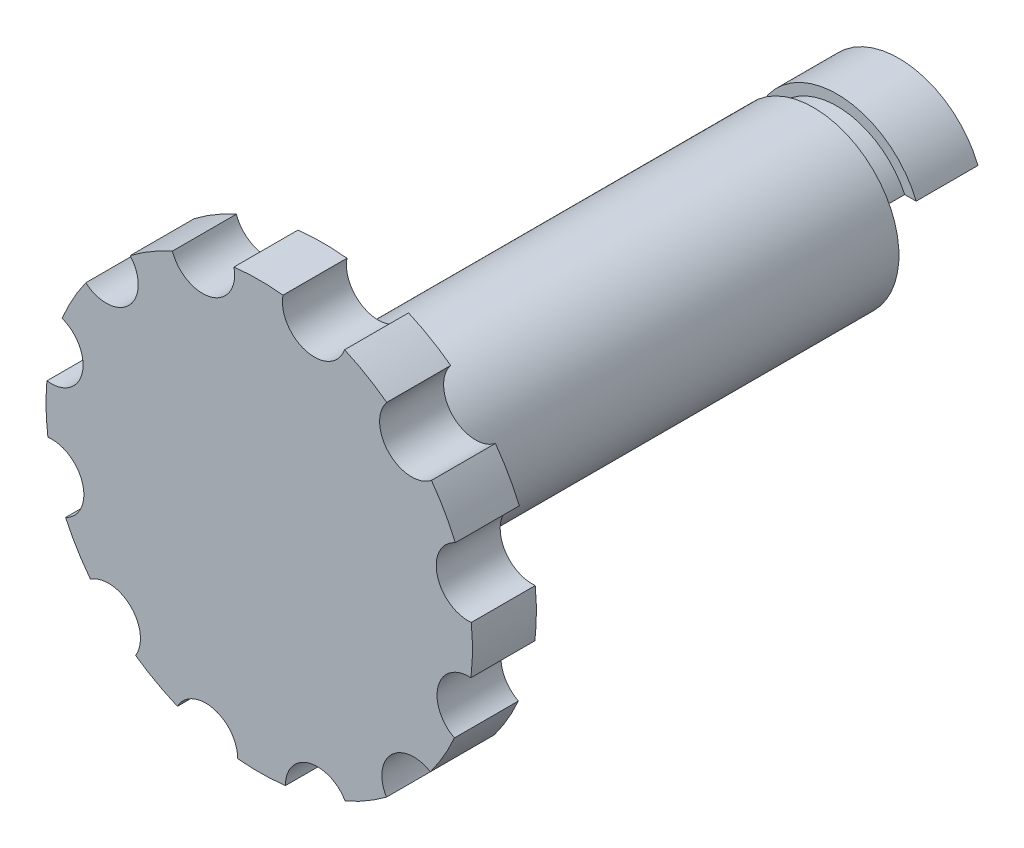
ISO-10303-21;
HEADER;
FILE_DESCRIPTION(('STEP AP214'),'2;1');
FILE_NAME('part.step','',(''),(''),'','','');
FILE_SCHEMA(('AUTOMOTIVE_DESIGN { 1 0 10303 214 1 1 1 1 }'));
ENDSEC;
DATA;
#1=APPLICATION_CONTEXT('core data for automotive mechanical design processes');
#2=APPLICATION_PROTOCOL_DEFINITION('international standard','automotive_design',2000,#1);
#3=PRODUCT_CONTEXT('',#1,'mechanical');
#4=PRODUCT('Part','Part','',(#3));
#5=PRODUCT_RELATED_PRODUCT_CATEGORY('part','',(#4));
#6=PRODUCT_DEFINITION_FORMATION('','',#4);
#7=PRODUCT_DEFINITION_CONTEXT('part definition',#1,'design');
#8=PRODUCT_DEFINITION('design','',#6,#7);
#9=PRODUCT_DEFINITION_SHAPE('','',#8);
#10=(LENGTH_UNIT() NAMED_UNIT(*) SI_UNIT(.MILLI.,.METRE.));
#11=(NAMED_UNIT(*) PLANE_ANGLE_UNIT() SI_UNIT($,.RADIAN.));
#12=(NAMED_UNIT(*) SI_UNIT($,.STERADIAN.) SOLID_ANGLE_UNIT());
#13=UNCERTAINTY_MEASURE_WITH_UNIT(LENGTH_MEASURE(1.E-05),#10,'distance_accuracy_value','');
#14=(GEOMETRIC_REPRESENTATION_CONTEXT(3) GLOBAL_UNCERTAINTY_ASSIGNED_CONTEXT((#13)) GLOBAL_UNIT_ASSIGNED_CONTEXT((#10,
#11,#12)) REPRESENTATION_CONTEXT('',''));
#15=CARTESIAN_POINT('',(0.,0.,0.));
#16=DIRECTION('',(0.,0.,1.));
#17=DIRECTION('',(1.,0.,0.));
#18=AXIS2_PLACEMENT_3D('',#15,#16,#17);
#19=CARTESIAN_POINT('',(0.,1.5,-22.));
#20=DIRECTION('',(0.,-1.,0.));
#21=DIRECTION('',(0.,0.,-1.));
#22=AXIS2_PLACEMENT_3D('',#19,#20,#21);
#23=PLANE('',#22);
#24=DIRECTION('',(-1.,0.,0.));
#25=VECTOR('',#24,1.);
#26=CARTESIAN_POINT('',(0.,1.5,-19.1));
#27=LINE('',#26,#25);
#28=CARTESIAN_POINT('',(3.70809924354783,1.5,-19.1));
#29=VERTEX_POINT('',#28);
#30=CARTESIAN_POINT('',(3.17123955301092,1.5,-19.1));
#31=VERTEX_POINT('',#30);
#32=EDGE_CURVE('E60',#29,#31,#27,.T.);
#33=ORIENTED_EDGE('',*,*,#32,.T.);
#34=DIRECTION('',(0.,0.,1.));
#35=VECTOR('',#34,1.);
#36=CARTESIAN_POINT('',(3.17123955301092,1.5,0.));
#37=LINE('',#36,#35);
#38=CARTESIAN_POINT('',(3.17123955301092,1.5,-18.));
#39=VERTEX_POINT('',#38);
#40=EDGE_CURVE('E226',#31,#39,#37,.T.);
#41=ORIENTED_EDGE('',*,*,#40,.T.);
#42=DIRECTION('',(1.,0.,0.));
#43=VECTOR('',#42,1.);
#44=CARTESIAN_POINT('',(0.,1.5,-18.));
#45=LINE('',#44,#43);
#46=CARTESIAN_POINT('',(-3.17123955301092,1.5,-18.));
#47=VERTEX_POINT('',#46);
#48=EDGE_CURVE('E399',#47,#39,#45,.T.);
#49=ORIENTED_EDGE('',*,*,#48,.F.);
#50=DIRECTION('',(0.,0.,1.));
#51=VECTOR('',#50,1.);
#52=CARTESIAN_POINT('',(-3.17123955301092,1.5,0.));
#53=LINE('',#52,#51);
#54=CARTESIAN_POINT('',(-3.17123955301092,1.5,-19.1));
#55=VERTEX_POINT('',#54);
#56=EDGE_CURVE('E240',#47,#55,#53,.F.);
#57=ORIENTED_EDGE('',*,*,#56,.T.);
#58=CARTESIAN_POINT('',(-3.70809924354783,1.5,-19.1));
#59=VERTEX_POINT('',#58);
#60=EDGE_CURVE('E245',#55,#59,#27,.T.);
#61=ORIENTED_EDGE('',*,*,#60,.T.);
#62=DIRECTION('',(0.,0.,1.));
#63=VECTOR('',#62,1.);
#64=CARTESIAN_POINT('',(-3.70809924354783,1.5,-22.));
#65=LINE('',#64,#63);
#66=CARTESIAN_POINT('',(-3.70809924354783,1.5,-22.));
#67=VERTEX_POINT('',#66);
#68=EDGE_CURVE('E402',#67,#59,#65,.T.);
#69=ORIENTED_EDGE('',*,*,#68,.F.);
#70=DIRECTION('',(1.,0.,0.));
#71=VECTOR('',#70,1.);
#72=CARTESIAN_POINT('',(0.,1.5,-22.));
#73=LINE('',#72,#71);
#74=CARTESIAN_POINT('',(3.70809924354783,1.5,-22.));
#75=VERTEX_POINT('',#74);
#76=EDGE_CURVE('E397',#67,#75,#73,.T.);
#77=ORIENTED_EDGE('',*,*,#76,.T.);
#78=DIRECTION('',(0.,0.,1.));
#79=VECTOR('',#78,1.);
#80=CARTESIAN_POINT('',(3.70809924354783,1.5,-22.));
#81=LINE('',#80,#79);
#82=EDGE_CURVE('E249',#75,#29,#81,.T.);
#83=ORIENTED_EDGE('',*,*,#82,.T.);
#84=EDGE_LOOP('',(#33,#41,#49,#57,#61,#69,#77,#83));
#85=FACE_BOUND('',#84,.T.);
#86=ADVANCED_FACE('F43',(#85),#23,.T.);
#87=CARTESIAN_POINT('',(0.,0.,-18.));
#88=DIRECTION('',(0.,0.,1.));
#89=DIRECTION('',(1.,0.,0.));
#90=AXIS2_PLACEMENT_3D('',#87,#88,#89);
#91=CYLINDRICAL_SURFACE('',#90,4.);
#92=CARTESIAN_POINT('',(0.,0.,5.));
#93=DIRECTION('',(0.,0.,-1.));
#94=DIRECTION('',(-1.,0.,0.));
#95=AXIS2_PLACEMENT_3D('',#92,#93,#94);
#96=CIRCLE('',#95,4.);
#97=CARTESIAN_POINT('',(-4.,0.,5.));
#98=VERTEX_POINT('',#97);
#99=EDGE_CURVE('E236',#98,#98,#96,.F.);
#100=ORIENTED_EDGE('',*,*,#99,.F.);
#101=EDGE_LOOP('',(#100));
#102=FACE_BOUND('',#101,.T.);
#103=CARTESIAN_POINT('',(0.,0.,-18.));
#104=DIRECTION('',(0.,0.,-1.));
#105=DIRECTION('',(-1.,0.,0.));
#106=AXIS2_PLACEMENT_3D('',#103,#104,#105);
#107=CIRCLE('',#106,4.);
#108=CARTESIAN_POINT('',(-4.,0.,-18.));
#109=VERTEX_POINT('',#108);
#110=EDGE_CURVE('E407',#109,#109,#107,.T.);
#111=ORIENTED_EDGE('',*,*,#110,.F.);
#112=EDGE_LOOP('',(#111));
#113=FACE_BOUND('',#112,.T.);
#114=ADVANCED_FACE('F550',(#102,#113),#91,.T.);
#115=CARTESIAN_POINT('',(0.,0.,-19.1));
#116=DIRECTION('',(0.,0.,1.));
#117=DIRECTION('',(1.,0.,0.));
#118=AXIS2_PLACEMENT_3D('',#115,#116,#117);
#119=CIRCLE('',#118,4.);
#120=EDGE_CURVE('E11',#29,#59,#119,.T.);
#121=ORIENTED_EDGE('',*,*,#120,.F.);
#122=ORIENTED_EDGE('',*,*,#82,.F.);
#123=CARTESIAN_POINT('',(0.,0.,-22.));
#124=DIRECTION('',(0.,0.,-1.));
#125=DIRECTION('',(-1.,0.,0.));
#126=AXIS2_PLACEMENT_3D('',#123,#124,#125);
#127=CIRCLE('',#126,4.);
#128=EDGE_CURVE('E396',#67,#75,#127,.T.);
#129=ORIENTED_EDGE('',*,*,#128,.F.);
#130=ORIENTED_EDGE('',*,*,#68,.T.);
#131=EDGE_LOOP('',(#121,#122,#129,#130));
#132=FACE_BOUND('',#131,.T.);
#133=ADVANCED_FACE('F554',(#132),#91,.T.);
#134=CARTESIAN_POINT('',(0.,0.,8.));
#135=DIRECTION('',(0.,0.,-1.));
#136=DIRECTION('',(-1.,0.,0.));
#137=AXIS2_PLACEMENT_3D('',#134,#135,#136);
#138=CYLINDRICAL_SURFACE('',#137,10.);
#139=CARTESIAN_POINT('',(0.,0.,5.));
#140=DIRECTION('',(0.,0.,-1.));
#141=DIRECTION('',(-1.,0.,0.));
#142=AXIS2_PLACEMENT_3D('',#139,#140,#141);
#143=CIRCLE('',#142,10.);
#144=CARTESIAN_POINT('',(-9.90917159457001,-1.34473726406572,5.));
#145=VERTEX_POINT('',#144);
#146=CARTESIAN_POINT('',(-9.95746445214562,0.92135860784842,5.));
#147=VERTEX_POINT('',#146);
#148=EDGE_CURVE('E260',#145,#147,#143,.T.);
#149=ORIENTED_EDGE('',*,*,#148,.F.);
#150=DIRECTION('',(0.,0.,1.));
#151=VECTOR('',#150,1.);
#152=CARTESIAN_POINT('',(-9.90917159457001,-1.34473726406572,-7.));
#153=LINE('',#152,#151);
#154=CARTESIAN_POINT('',(-9.90917159457001,-1.34473726406572,8.));
#155=VERTEX_POINT('',#154);
#156=EDGE_CURVE('E393',#145,#155,#153,.T.);
#157=ORIENTED_EDGE('',*,*,#156,.T.);
#158=CARTESIAN_POINT('',(0.,0.,8.));
#159=DIRECTION('',(0.,0.,1.));
#160=DIRECTION('',(1.,0.,0.));
#161=AXIS2_PLACEMENT_3D('',#158,#159,#160);
#162=CIRCLE('',#161,10.);
#163=CARTESIAN_POINT('',(-9.95746445214562,0.92135860784842,8.));
#164=VERTEX_POINT('',#163);
#165=EDGE_CURVE('E433',#164,#155,#162,.T.);
#166=ORIENTED_EDGE('',*,*,#165,.F.);
#167=DIRECTION('',(0.,0.,1.));
#168=VECTOR('',#167,1.);
#169=CARTESIAN_POINT('',(-9.95746445214562,0.92135860784842,-7.));
#170=LINE('',#169,#168);
#171=EDGE_CURVE('E355',#164,#147,#170,.F.);
#172=ORIENTED_EDGE('',*,*,#171,.T.);
#173=EDGE_LOOP('',(#149,#157,#166,#172));
#174=FACE_BOUND('',#173,.T.);
#175=ADVANCED_FACE('F44',(#174),#138,.T.);
#176=CARTESIAN_POINT('',(0.,0.,5.));
#177=DIRECTION('',(0.,0.,-1.));
#178=DIRECTION('',(-1.,0.,0.));
#179=AXIS2_PLACEMENT_3D('',#176,#177,#178);
#180=CIRCLE('',#179,10.);
#181=CARTESIAN_POINT('',(-7.91348405973703,-6.11365439293782,5.));
#182=VERTEX_POINT('',#181);
#183=CARTESIAN_POINT('',(-9.08051493621667,-4.18858550027883,5.));
#184=VERTEX_POINT('',#183);
#185=EDGE_CURVE('E62',#182,#184,#180,.T.);
#186=ORIENTED_EDGE('',*,*,#185,.F.);
#187=DIRECTION('',(0.,0.,1.));
#188=VECTOR('',#187,1.);
#189=CARTESIAN_POINT('',(-7.91348405973703,-6.11365439293782,-7.));
#190=LINE('',#189,#188);
#191=CARTESIAN_POINT('',(-7.91348405973703,-6.11365439293782,8.));
#192=VERTEX_POINT('',#191);
#193=EDGE_CURVE('E387',#182,#192,#190,.T.);
#194=ORIENTED_EDGE('',*,*,#193,.T.);
#195=CARTESIAN_POINT('',(-9.08051493621667,-4.18858550027883,8.));
#196=VERTEX_POINT('',#195);
#197=EDGE_CURVE('E438',#196,#192,#162,.T.);
#198=ORIENTED_EDGE('',*,*,#197,.F.);
#199=DIRECTION('',(0.,0.,1.));
#200=VECTOR('',#199,1.);
#201=CARTESIAN_POINT('',(-9.08051493621667,-4.18858550027883,-7.));
#202=LINE('',#201,#200);
#203=EDGE_CURVE('E395',#196,#184,#202,.F.);
#204=ORIENTED_EDGE('',*,*,#203,.T.);
#205=EDGE_LOOP('',(#186,#194,#198,#204));
#206=FACE_BOUND('',#205,.T.);
#207=ADVANCED_FACE('F519',(#206),#138,.T.);
#208=CARTESIAN_POINT('',(0.,0.,5.));
#209=DIRECTION('',(0.,0.,-1.));
#210=DIRECTION('',(-1.,0.,0.));
#211=AXIS2_PLACEMENT_3D('',#208,#209,#210);
#212=CIRCLE('',#211,10.);
#213=CARTESIAN_POINT('',(-3.83432726912444,-9.23568808444984,5.));
#214=VERTEX_POINT('',#213);
#215=CARTESIAN_POINT('',(-5.79698261183855,-8.14831225457404,5.));
#216=VERTEX_POINT('',#215);
#217=EDGE_CURVE('E300',#214,#216,#212,.T.);
#218=ORIENTED_EDGE('',*,*,#217,.F.);
#219=DIRECTION('',(0.,0.,1.));
#220=VECTOR('',#219,1.);
#221=CARTESIAN_POINT('',(-3.83432726912443,-9.23568808444984,-7.));
#222=LINE('',#221,#220);
#223=CARTESIAN_POINT('',(-3.83432726912443,-9.23568808444984,8.));
#224=VERTEX_POINT('',#223);
#225=EDGE_CURVE('E383',#214,#224,#222,.T.);
#226=ORIENTED_EDGE('',*,*,#225,.T.);
#227=CARTESIAN_POINT('',(-5.79698261183855,-8.14831225457404,8.));
#228=VERTEX_POINT('',#227);
#229=EDGE_CURVE('E444',#228,#224,#162,.T.);
#230=ORIENTED_EDGE('',*,*,#229,.F.);
#231=DIRECTION('',(0.,0.,1.));
#232=VECTOR('',#231,1.);
#233=CARTESIAN_POINT('',(-5.79698261183855,-8.14831225457404,-7.));
#234=LINE('',#233,#232);
#235=EDGE_CURVE('E386',#228,#216,#234,.F.);
#236=ORIENTED_EDGE('',*,*,#235,.T.);
#237=EDGE_LOOP('',(#218,#226,#230,#236));
#238=FACE_BOUND('',#237,.T.);
#239=ADVANCED_FACE('F521',(#238),#138,.T.);
#240=CARTESIAN_POINT('',(0.,0.,5.));
#241=DIRECTION('',(0.,0.,-1.));
#242=DIRECTION('',(-1.,0.,0.));
#243=AXIS2_PLACEMENT_3D('',#240,#241,#242);
#244=CIRCLE('',#243,10.);
#245=CARTESIAN_POINT('',(1.23126987604767,-9.92390923438629,5.));
#246=VERTEX_POINT('',#245);
#247=CARTESIAN_POINT('',(-1.01050990389204,-9.9488124785894,5.));
#248=VERTEX_POINT('',#247);
#249=EDGE_CURVE('E293',#246,#248,#244,.T.);
#250=ORIENTED_EDGE('',*,*,#249,.F.);
#251=DIRECTION('',(0.,0.,1.));
#252=VECTOR('',#251,1.);
#253=CARTESIAN_POINT('',(1.23126987604767,-9.92390923438629,-7.));
#254=LINE('',#253,#252);
#255=CARTESIAN_POINT('',(1.23126987604767,-9.92390923438629,8.));
#256=VERTEX_POINT('',#255);
#257=EDGE_CURVE('E379',#246,#256,#254,.T.);
#258=ORIENTED_EDGE('',*,*,#257,.T.);
#259=CARTESIAN_POINT('',(-1.01050990389204,-9.9488124785894,8.));
#260=VERTEX_POINT('',#259);
#261=EDGE_CURVE('E449',#260,#256,#162,.T.);
#262=ORIENTED_EDGE('',*,*,#261,.F.);
#263=DIRECTION('',(0.,0.,1.));
#264=VECTOR('',#263,1.);
#265=CARTESIAN_POINT('',(-1.01050990389204,-9.9488124785894,-7.));
#266=LINE('',#265,#264);
#267=EDGE_CURVE('E385',#260,#248,#266,.F.);
#268=ORIENTED_EDGE('',*,*,#267,.T.);
#269=EDGE_LOOP('',(#250,#258,#262,#268));
#270=FACE_BOUND('',#269,.T.);
#271=ADVANCED_FACE('F535',(#270),#138,.T.);
#272=CARTESIAN_POINT('',(0.,0.,5.));
#273=DIRECTION('',(0.,0.,-1.));
#274=DIRECTION('',(-1.,0.,0.));
#275=AXIS2_PLACEMENT_3D('',#272,#273,#274);
#276=CIRCLE('',#275,10.);
#277=CARTESIAN_POINT('',(5.96742383944693,-8.02432880186252,5.));
#278=VERTEX_POINT('',#277);
#279=CARTESIAN_POINT('',(4.02980613219721,-9.15208514694361,5.));
#280=VERTEX_POINT('',#279);
#281=EDGE_CURVE('E292',#278,#280,#276,.T.);
#282=ORIENTED_EDGE('',*,*,#281,.F.);
#283=DIRECTION('',(0.,0.,1.));
#284=VECTOR('',#283,1.);
#285=CARTESIAN_POINT('',(5.96742383944694,-8.02432880186252,-7.));
#286=LINE('',#285,#284);
#287=CARTESIAN_POINT('',(5.96742383944694,-8.02432880186252,8.));
#288=VERTEX_POINT('',#287);
#289=EDGE_CURVE('E371',#278,#288,#286,.T.);
#290=ORIENTED_EDGE('',*,*,#289,.T.);
#291=CARTESIAN_POINT('',(4.02980613219721,-9.15208514694361,8.));
#292=VERTEX_POINT('',#291);
#293=EDGE_CURVE('E420',#292,#288,#162,.T.);
#294=ORIENTED_EDGE('',*,*,#293,.F.);
#295=DIRECTION('',(0.,0.,1.));
#296=VECTOR('',#295,1.);
#297=CARTESIAN_POINT('',(4.02980613219721,-9.15208514694361,-7.));
#298=LINE('',#297,#296);
#299=EDGE_CURVE('E380',#292,#280,#298,.F.);
#300=ORIENTED_EDGE('',*,*,#299,.T.);
#301=EDGE_LOOP('',(#282,#290,#294,#300));
#302=FACE_BOUND('',#301,.T.);
#303=ADVANCED_FACE('F458',(#302),#138,.T.);
#304=CARTESIAN_POINT('',(0.,0.,5.));
#305=DIRECTION('',(0.,0.,-1.));
#306=DIRECTION('',(-1.,0.,0.));
#307=AXIS2_PLACEMENT_3D('',#304,#305,#306);
#308=CIRCLE('',#307,10.);
#309=CARTESIAN_POINT('',(9.15427922502021,-4.02481948295367,5.));
#310=VERTEX_POINT('',#309);
#311=CARTESIAN_POINT('',(8.02648080471782,-5.96452897482243,5.));
#312=VERTEX_POINT('',#311);
#313=EDGE_CURVE('E286',#310,#312,#308,.T.);
#314=ORIENTED_EDGE('',*,*,#313,.F.);
#315=DIRECTION('',(0.,0.,1.));
#316=VECTOR('',#315,1.);
#317=CARTESIAN_POINT('',(9.15427922502021,-4.02481948295366,-7.));
#318=LINE('',#317,#316);
#319=CARTESIAN_POINT('',(9.15427922502021,-4.02481948295366,8.));
#320=VERTEX_POINT('',#319);
#321=EDGE_CURVE('E368',#310,#320,#318,.T.);
#322=ORIENTED_EDGE('',*,*,#321,.T.);
#323=CARTESIAN_POINT('',(8.02648080471782,-5.96452897482243,8.));
#324=VERTEX_POINT('',#323);
#325=EDGE_CURVE('E413',#324,#320,#162,.T.);
#326=ORIENTED_EDGE('',*,*,#325,.F.);
#327=DIRECTION('',(0.,0.,1.));
#328=VECTOR('',#327,1.);
#329=CARTESIAN_POINT('',(8.02648080471782,-5.96452897482243,-7.));
#330=LINE('',#329,#328);
#331=EDGE_CURVE('E374',#324,#312,#330,.F.);
#332=ORIENTED_EDGE('',*,*,#331,.T.);
#333=EDGE_LOOP('',(#314,#322,#326,#332));
#334=FACE_BOUND('',#333,.T.);
#335=ADVANCED_FACE('F470',(#334),#138,.T.);
#336=CARTESIAN_POINT('',(0.,0.,5.));
#337=DIRECTION('',(0.,0.,-1.));
#338=DIRECTION('',(-1.,0.,0.));
#339=AXIS2_PLACEMENT_3D('',#336,#337,#338);
#340=CIRCLE('',#339,10.);
#341=CARTESIAN_POINT('',(4.00388130166313,9.16345647243399,5.));
#342=VERTEX_POINT('',#341);
#343=CARTESIAN_POINT('',(5.98029267254369,8.01474263783437,5.));
#344=VERTEX_POINT('',#343);
#345=EDGE_CURVE('E274',#342,#344,#340,.T.);
#346=ORIENTED_EDGE('',*,*,#345,.F.);
#347=DIRECTION('',(0.,0.,1.));
#348=VECTOR('',#347,1.);
#349=CARTESIAN_POINT('',(4.00388130166314,9.16345647243399,-7.));
#350=LINE('',#349,#348);
#351=CARTESIAN_POINT('',(4.00388130166314,9.16345647243399,8.));
#352=VERTEX_POINT('',#351);
#353=EDGE_CURVE('E362',#342,#352,#350,.T.);
#354=ORIENTED_EDGE('',*,*,#353,.T.);
#355=CARTESIAN_POINT('',(5.98029267254369,8.01474263783437,8.));
#356=VERTEX_POINT('',#355);
#357=EDGE_CURVE('E417',#356,#352,#162,.T.);
#358=ORIENTED_EDGE('',*,*,#357,.F.);
#359=DIRECTION('',(0.,0.,1.));
#360=VECTOR('',#359,1.);
#361=CARTESIAN_POINT('',(5.98029267254369,8.01474263783437,-7.));
#362=LINE('',#361,#360);
#363=EDGE_CURVE('E340',#356,#344,#362,.F.);
#364=ORIENTED_EDGE('',*,*,#363,.T.);
#365=EDGE_LOOP('',(#346,#354,#358,#364));
#366=FACE_BOUND('',#365,.T.);
#367=ADVANCED_FACE('F488',(#366),#138,.T.);
#368=CARTESIAN_POINT('',(0.,0.,5.));
#369=DIRECTION('',(0.,0.,-1.));
#370=DIRECTION('',(-1.,0.,0.));
#371=AXIS2_PLACEMENT_3D('',#368,#369,#370);
#372=CIRCLE('',#371,10.);
#373=CARTESIAN_POINT('',(9.94384762083846,1.05825067613741,5.));
#374=VERTEX_POINT('',#373);
#375=CARTESIAN_POINT('',(9.92859616144193,-1.19288652561782,5.));
#376=VERTEX_POINT('',#375);
#377=EDGE_CURVE('E284',#374,#376,#372,.T.);
#378=ORIENTED_EDGE('',*,*,#377,.F.);
#379=DIRECTION('',(0.,0.,1.));
#380=VECTOR('',#379,1.);
#381=CARTESIAN_POINT('',(9.94384762083846,1.05825067613742,-7.));
#382=LINE('',#381,#380);
#383=CARTESIAN_POINT('',(9.94384762083846,1.05825067613742,8.));
#384=VERTEX_POINT('',#383);
#385=EDGE_CURVE('E358',#374,#384,#382,.T.);
#386=ORIENTED_EDGE('',*,*,#385,.T.);
#387=CARTESIAN_POINT('',(9.92859616144193,-1.19288652561782,8.));
#388=VERTEX_POINT('',#387);
#389=EDGE_CURVE('E410',#388,#384,#162,.T.);
#390=ORIENTED_EDGE('',*,*,#389,.F.);
#391=DIRECTION('',(0.,0.,1.));
#392=VECTOR('',#391,1.);
#393=CARTESIAN_POINT('',(9.92859616144193,-1.19288652561782,-7.));
#394=LINE('',#393,#392);
#395=EDGE_CURVE('E370',#388,#376,#394,.F.);
#396=ORIENTED_EDGE('',*,*,#395,.T.);
#397=EDGE_LOOP('',(#378,#386,#390,#396));
#398=FACE_BOUND('',#397,.T.);
#399=ADVANCED_FACE('F474',(#398),#138,.T.);
#400=CARTESIAN_POINT('',(0.,0.,5.));
#401=DIRECTION('',(0.,0.,-1.));
#402=DIRECTION('',(-1.,0.,0.));
#403=AXIS2_PLACEMENT_3D('',#400,#401,#402);
#404=CIRCLE('',#403,10.);
#405=CARTESIAN_POINT('',(-9.24320622023551,3.81616807415496,5.));
#406=VERTEX_POINT('',#405);
#407=CARTESIAN_POINT('',(-8.13503843802609,5.81559537896491,5.));
#408=VERTEX_POINT('',#407);
#409=EDGE_CURVE('E261',#406,#408,#404,.T.);
#410=ORIENTED_EDGE('',*,*,#409,.F.);
#411=DIRECTION('',(0.,0.,1.));
#412=VECTOR('',#411,1.);
#413=CARTESIAN_POINT('',(-9.24320622023551,3.81616807415496,-7.));
#414=LINE('',#413,#412);
#415=CARTESIAN_POINT('',(-9.24320622023551,3.81616807415496,8.));
#416=VERTEX_POINT('',#415);
#417=EDGE_CURVE('E354',#406,#416,#414,.T.);
#418=ORIENTED_EDGE('',*,*,#417,.T.);
#419=CARTESIAN_POINT('',(-8.13503843802609,5.81559537896491,8.));
#420=VERTEX_POINT('',#419);
#421=EDGE_CURVE('E432',#420,#416,#162,.T.);
#422=ORIENTED_EDGE('',*,*,#421,.F.);
#423=DIRECTION('',(0.,0.,1.));
#424=VECTOR('',#423,1.);
#425=CARTESIAN_POINT('',(-8.13503843802609,5.81559537896491,-7.));
#426=LINE('',#425,#424);
#427=EDGE_CURVE('E350',#420,#408,#426,.F.);
#428=ORIENTED_EDGE('',*,*,#427,.T.);
#429=EDGE_LOOP('',(#410,#418,#422,#428));
#430=FACE_BOUND('',#429,.T.);
#431=ADVANCED_FACE('F510',(#430),#138,.T.);
#432=CARTESIAN_POINT('',(0.,0.,5.));
#433=DIRECTION('',(0.,0.,-1.));
#434=DIRECTION('',(-1.,0.,0.));
#435=AXIS2_PLACEMENT_3D('',#432,#433,#434);
#436=CIRCLE('',#435,10.);
#437=CARTESIAN_POINT('',(-6.05082845848132,7.9616251460385,5.));
#438=VERTEX_POINT('',#437);
#439=CARTESIAN_POINT('',(-4.07197032619047,9.13340339975325,5.));
#440=VERTEX_POINT('',#439);
#441=EDGE_CURVE('E270',#438,#440,#436,.T.);
#442=ORIENTED_EDGE('',*,*,#441,.F.);
#443=DIRECTION('',(0.,0.,1.));
#444=VECTOR('',#443,1.);
#445=CARTESIAN_POINT('',(-6.05082845848132,7.9616251460385,-7.));
#446=LINE('',#445,#444);
#447=CARTESIAN_POINT('',(-6.05082845848132,7.9616251460385,8.));
#448=VERTEX_POINT('',#447);
#449=EDGE_CURVE('E349',#438,#448,#446,.T.);
#450=ORIENTED_EDGE('',*,*,#449,.T.);
#451=CARTESIAN_POINT('',(-4.07197032619047,9.13340339975325,8.));
#452=VERTEX_POINT('',#451);
#453=EDGE_CURVE('E430',#452,#448,#162,.T.);
#454=ORIENTED_EDGE('',*,*,#453,.F.);
#455=DIRECTION('',(0.,0.,1.));
#456=VECTOR('',#455,1.);
#457=CARTESIAN_POINT('',(-4.07197032619047,9.13340339975325,-7.));
#458=LINE('',#457,#456);
#459=EDGE_CURVE('E345',#452,#440,#458,.F.);
#460=ORIENTED_EDGE('',*,*,#459,.T.);
#461=EDGE_LOOP('',(#442,#450,#454,#460));
#462=FACE_BOUND('',#461,.T.);
#463=ADVANCED_FACE('F499',(#462),#138,.T.);
#464=CARTESIAN_POINT('',(0.,0.,5.));
#465=DIRECTION('',(0.,0.,-1.));
#466=DIRECTION('',(-1.,0.,0.));
#467=AXIS2_PLACEMENT_3D('',#464,#465,#466);
#468=CIRCLE('',#467,10.);
#469=CARTESIAN_POINT('',(-1.18549028217473,9.92948200012817,5.));
#470=VERTEX_POINT('',#469);
#471=CARTESIAN_POINT('',(1.11426531523922,9.93772674243234,5.));
#472=VERTEX_POINT('',#471);
#473=EDGE_CURVE('E271',#470,#472,#468,.T.);
#474=ORIENTED_EDGE('',*,*,#473,.F.);
#475=DIRECTION('',(0.,0.,1.));
#476=VECTOR('',#475,1.);
#477=CARTESIAN_POINT('',(-1.18549028217473,9.92948200012817,-7.));
#478=LINE('',#477,#476);
#479=CARTESIAN_POINT('',(-1.18549028217473,9.92948200012817,8.));
#480=VERTEX_POINT('',#479);
#481=EDGE_CURVE('E344',#470,#480,#478,.T.);
#482=ORIENTED_EDGE('',*,*,#481,.T.);
#483=CARTESIAN_POINT('',(1.11426531523922,9.93772674243234,8.));
#484=VERTEX_POINT('',#483);
#485=EDGE_CURVE('E423',#484,#480,#162,.T.);
#486=ORIENTED_EDGE('',*,*,#485,.F.);
#487=DIRECTION('',(0.,0.,1.));
#488=VECTOR('',#487,1.);
#489=CARTESIAN_POINT('',(1.11426531523922,9.93772674243234,-7.));
#490=LINE('',#489,#488);
#491=EDGE_CURVE('E361',#484,#472,#490,.F.);
#492=ORIENTED_EDGE('',*,*,#491,.T.);
#493=EDGE_LOOP('',(#474,#482,#486,#492));
#494=FACE_BOUND('',#493,.T.);
#495=ADVANCED_FACE('F493',(#494),#138,.T.);
#496=CARTESIAN_POINT('',(0.,0.,5.));
#497=DIRECTION('',(0.,0.,-1.));
#498=DIRECTION('',(-1.,0.,0.));
#499=AXIS2_PLACEMENT_3D('',#496,#497,#498);
#500=CIRCLE('',#499,10.);
#501=CARTESIAN_POINT('',(8.07745667721353,5.89531115614252,5.));
#502=VERTEX_POINT('',#501);
#503=CARTESIAN_POINT('',(9.19759452981835,3.92482545663569,5.));
#504=VERTEX_POINT('',#503);
#505=EDGE_CURVE('E278',#502,#504,#500,.T.);
#506=ORIENTED_EDGE('',*,*,#505,.F.);
#507=DIRECTION('',(0.,0.,1.));
#508=VECTOR('',#507,1.);
#509=CARTESIAN_POINT('',(8.07745667721353,5.89531115614252,-7.));
#510=LINE('',#509,#508);
#511=CARTESIAN_POINT('',(8.07745667721353,5.89531115614252,8.));
#512=VERTEX_POINT('',#511);
#513=EDGE_CURVE('E337',#502,#512,#510,.T.);
#514=ORIENTED_EDGE('',*,*,#513,.T.);
#515=CARTESIAN_POINT('',(9.19759452981835,3.92482545663569,8.));
#516=VERTEX_POINT('',#515);
#517=EDGE_CURVE('E51',#516,#512,#162,.T.);
#518=ORIENTED_EDGE('',*,*,#517,.F.);
#519=DIRECTION('',(0.,0.,1.));
#520=VECTOR('',#519,1.);
#521=CARTESIAN_POINT('',(9.19759452981835,3.92482545663569,-7.));
#522=LINE('',#521,#520);
#523=EDGE_CURVE('E360',#516,#504,#522,.F.);
#524=ORIENTED_EDGE('',*,*,#523,.T.);
#525=EDGE_LOOP('',(#506,#514,#518,#524));
#526=FACE_BOUND('',#525,.T.);
#527=ADVANCED_FACE('F477',(#526),#138,.T.);
#528=CARTESIAN_POINT('',(7.14670622053036,7.07162046384355,-22.));
#529=DIRECTION('',(0.,0.,1.));
#530=DIRECTION('',(1.,0.,0.));
#531=AXIS2_PLACEMENT_3D('',#528,#529,#530);
#532=CYLINDRICAL_SURFACE('',#531,1.5);
#533=CARTESIAN_POINT('',(7.14670622053036,7.07162046384355,5.));
#534=DIRECTION('',(0.,0.,-1.));
#535=DIRECTION('',(-1.,0.,0.));
#536=AXIS2_PLACEMENT_3D('',#533,#534,#535);
#537=CIRCLE('',#536,1.5);
#538=EDGE_CURVE('E280',#344,#502,#537,.F.);
#539=ORIENTED_EDGE('',*,*,#538,.F.);
#540=ORIENTED_EDGE('',*,*,#363,.F.);
#541=CARTESIAN_POINT('',(7.14670622053036,7.07162046384355,8.));
#542=DIRECTION('',(0.,0.,1.));
#543=DIRECTION('',(1.,0.,0.));
#544=AXIS2_PLACEMENT_3D('',#541,#542,#543);
#545=CIRCLE('',#544,1.5);
#546=EDGE_CURVE('E328',#356,#512,#545,.T.);
#547=ORIENTED_EDGE('',*,*,#546,.T.);
#548=ORIENTED_EDGE('',*,*,#513,.F.);
#549=EDGE_LOOP('',(#539,#540,#547,#548));
#550=FACE_BOUND('',#549,.T.);
#551=ADVANCED_FACE('F481',(#550),#532,.F.);
#552=CARTESIAN_POINT('',(-2.65341890844178,9.62096044790578,-22.));
#553=DIRECTION('',(0.,0.,1.));
#554=DIRECTION('',(1.,0.,0.));
#555=AXIS2_PLACEMENT_3D('',#552,#553,#554);
#556=CYLINDRICAL_SURFACE('',#555,1.5);
#557=CARTESIAN_POINT('',(-2.65341890844178,9.62096044790578,5.));
#558=DIRECTION('',(0.,0.,-1.));
#559=DIRECTION('',(-1.,0.,0.));
#560=AXIS2_PLACEMENT_3D('',#557,#558,#559);
#561=CIRCLE('',#560,1.5);
#562=EDGE_CURVE('E267',#440,#470,#561,.F.);
#563=ORIENTED_EDGE('',*,*,#562,.F.);
#564=ORIENTED_EDGE('',*,*,#459,.F.);
#565=CARTESIAN_POINT('',(-2.65341890844178,9.62096044790578,8.));
#566=DIRECTION('',(0.,0.,1.));
#567=DIRECTION('',(1.,0.,0.));
#568=AXIS2_PLACEMENT_3D('',#565,#566,#567);
#569=CIRCLE('',#568,1.5);
#570=EDGE_CURVE('E303',#452,#480,#569,.T.);
#571=ORIENTED_EDGE('',*,*,#570,.T.);
#572=ORIENTED_EDGE('',*,*,#481,.F.);
#573=EDGE_LOOP('',(#563,#564,#571,#572));
#574=FACE_BOUND('',#573,.T.);
#575=ADVANCED_FACE('F500',(#574),#556,.F.);
#576=CARTESIAN_POINT('',(-7.17363686296203,6.96698888748592,-22.));
#577=DIRECTION('',(0.,0.,1.));
#578=DIRECTION('',(1.,0.,0.));
#579=AXIS2_PLACEMENT_3D('',#576,#577,#578);
#580=CYLINDRICAL_SURFACE('',#579,1.5);
#581=CARTESIAN_POINT('',(-7.17363686296203,6.96698888748592,5.));
#582=DIRECTION('',(0.,0.,-1.));
#583=DIRECTION('',(-1.,0.,0.));
#584=AXIS2_PLACEMENT_3D('',#581,#582,#583);
#585=CIRCLE('',#584,1.5);
#586=EDGE_CURVE('E262',#408,#438,#585,.F.);
#587=ORIENTED_EDGE('',*,*,#586,.F.);
#588=ORIENTED_EDGE('',*,*,#427,.F.);
#589=CARTESIAN_POINT('',(-7.17363686296203,6.96698888748592,8.));
#590=DIRECTION('',(0.,0.,1.));
#591=DIRECTION('',(1.,0.,0.));
#592=AXIS2_PLACEMENT_3D('',#589,#590,#591);
#593=CIRCLE('',#592,1.5);
#594=EDGE_CURVE('E307',#420,#448,#593,.T.);
#595=ORIENTED_EDGE('',*,*,#594,.T.);
#596=ORIENTED_EDGE('',*,*,#449,.F.);
#597=EDGE_LOOP('',(#587,#588,#595,#596));
#598=FACE_BOUND('',#597,.T.);
#599=ADVANCED_FACE('F503',(#598),#580,.F.);
#600=CARTESIAN_POINT('',(-9.76127466200916,2.40847311798078,-22.));
#601=DIRECTION('',(0.,0.,1.));
#602=DIRECTION('',(1.,0.,0.));
#603=AXIS2_PLACEMENT_3D('',#600,#601,#602);
#604=CYLINDRICAL_SURFACE('',#603,1.5);
#605=CARTESIAN_POINT('',(-9.76127466200916,2.40847311798078,5.));
#606=DIRECTION('',(0.,0.,-1.));
#607=DIRECTION('',(-1.,0.,0.));
#608=AXIS2_PLACEMENT_3D('',#605,#606,#607);
#609=CIRCLE('',#608,1.5);
#610=EDGE_CURVE('E263',#147,#406,#609,.F.);
#611=ORIENTED_EDGE('',*,*,#610,.F.);
#612=ORIENTED_EDGE('',*,*,#171,.F.);
#613=CARTESIAN_POINT('',(-9.76127466200916,2.40847311798078,8.));
#614=DIRECTION('',(0.,0.,1.));
#615=DIRECTION('',(1.,0.,0.));
#616=AXIS2_PLACEMENT_3D('',#613,#614,#615);
#617=CIRCLE('',#616,1.5);
#618=EDGE_CURVE('E305',#164,#416,#617,.T.);
#619=ORIENTED_EDGE('',*,*,#618,.T.);
#620=ORIENTED_EDGE('',*,*,#417,.F.);
#621=EDGE_LOOP('',(#611,#612,#619,#620));
#622=FACE_BOUND('',#621,.T.);
#623=ADVANCED_FACE('F514',(#622),#604,.F.);
#624=CARTESIAN_POINT('',(9.80067778095021,2.55140250932331,-22.));
#625=DIRECTION('',(0.,0.,1.));
#626=DIRECTION('',(1.,0.,0.));
#627=AXIS2_PLACEMENT_3D('',#624,#625,#626);
#628=CYLINDRICAL_SURFACE('',#627,1.5);
#629=CARTESIAN_POINT('',(9.80067778095021,2.55140250932331,5.));
#630=DIRECTION('',(0.,0.,-1.));
#631=DIRECTION('',(-1.,0.,0.));
#632=AXIS2_PLACEMENT_3D('',#629,#630,#631);
#633=CIRCLE('',#632,1.5);
#634=EDGE_CURVE('E282',#504,#374,#633,.F.);
#635=ORIENTED_EDGE('',*,*,#634,.F.);
#636=ORIENTED_EDGE('',*,*,#523,.F.);
#637=CARTESIAN_POINT('',(9.80067778095021,2.55140250932331,8.));
#638=DIRECTION('',(0.,0.,1.));
#639=DIRECTION('',(1.,0.,0.));
#640=AXIS2_PLACEMENT_3D('',#637,#638,#639);
#641=CIRCLE('',#640,1.5);
#642=EDGE_CURVE('E322',#516,#384,#641,.T.);
#643=ORIENTED_EDGE('',*,*,#642,.T.);
#644=ORIENTED_EDGE('',*,*,#385,.F.);
#645=EDGE_LOOP('',(#635,#636,#643,#644));
#646=FACE_BOUND('',#645,.T.);
#647=ADVANCED_FACE('F478',(#646),#628,.F.);
#648=CARTESIAN_POINT('',(2.58819045102521,9.65925826289068,-22.));
#649=DIRECTION('',(0.,0.,1.));
#650=DIRECTION('',(1.,0.,0.));
#651=AXIS2_PLACEMENT_3D('',#648,#649,#650);
#652=CYLINDRICAL_SURFACE('',#651,1.5);
#653=CARTESIAN_POINT('',(2.58819045102521,9.65925826289068,5.));
#654=DIRECTION('',(0.,0.,-1.));
#655=DIRECTION('',(-1.,0.,0.));
#656=AXIS2_PLACEMENT_3D('',#653,#654,#655);
#657=CIRCLE('',#656,1.5);
#658=EDGE_CURVE('E273',#472,#342,#657,.F.);
#659=ORIENTED_EDGE('',*,*,#658,.F.);
#660=ORIENTED_EDGE('',*,*,#491,.F.);
#661=CARTESIAN_POINT('',(2.58819045102521,9.65925826289068,8.));
#662=DIRECTION('',(0.,0.,1.));
#663=DIRECTION('',(1.,0.,0.));
#664=AXIS2_PLACEMENT_3D('',#661,#662,#663);
#665=CIRCLE('',#664,1.5);
#666=EDGE_CURVE('E330',#484,#352,#665,.T.);
#667=ORIENTED_EDGE('',*,*,#666,.T.);
#668=ORIENTED_EDGE('',*,*,#353,.F.);
#669=EDGE_LOOP('',(#659,#660,#667,#668));
#670=FACE_BOUND('',#669,.T.);
#671=ADVANCED_FACE('F487',(#670),#652,.F.);
#672=CARTESIAN_POINT('',(9.83897559593511,-2.69020685014369,-22.));
#673=DIRECTION('',(0.,0.,1.));
#674=DIRECTION('',(1.,0.,0.));
#675=AXIS2_PLACEMENT_3D('',#672,#673,#674);
#676=CYLINDRICAL_SURFACE('',#675,1.5);
#677=CARTESIAN_POINT('',(9.83897559593511,-2.69020685014369,5.));
#678=DIRECTION('',(0.,0.,-1.));
#679=DIRECTION('',(-1.,0.,0.));
#680=AXIS2_PLACEMENT_3D('',#677,#678,#679);
#681=CIRCLE('',#680,1.5);
#682=EDGE_CURVE('E283',#376,#310,#681,.F.);
#683=ORIENTED_EDGE('',*,*,#682,.F.);
#684=ORIENTED_EDGE('',*,*,#395,.F.);
#685=CARTESIAN_POINT('',(9.83897559593511,-2.69020685014369,8.));
#686=DIRECTION('',(0.,0.,1.));
#687=DIRECTION('',(1.,0.,0.));
#688=AXIS2_PLACEMENT_3D('',#685,#686,#687);
#689=CIRCLE('',#688,1.5);
#690=EDGE_CURVE('E329',#388,#320,#689,.T.);
#691=ORIENTED_EDGE('',*,*,#690,.T.);
#692=ORIENTED_EDGE('',*,*,#321,.F.);
#693=EDGE_LOOP('',(#683,#684,#691,#692));
#694=FACE_BOUND('',#693,.T.);
#695=ADVANCED_FACE('F538',(#694),#676,.F.);
#696=CARTESIAN_POINT('',(7.25133779688798,-7.24872261964883,-22.));
#697=DIRECTION('',(0.,0.,1.));
#698=DIRECTION('',(1.,0.,0.));
#699=AXIS2_PLACEMENT_3D('',#696,#697,#698);
#700=CYLINDRICAL_SURFACE('',#699,1.5);
#701=CARTESIAN_POINT('',(7.25133779688798,-7.24872261964883,5.));
#702=DIRECTION('',(0.,0.,-1.));
#703=DIRECTION('',(-1.,0.,0.));
#704=AXIS2_PLACEMENT_3D('',#701,#702,#703);
#705=CIRCLE('',#704,1.5);
#706=EDGE_CURVE('E288',#312,#278,#705,.F.);
#707=ORIENTED_EDGE('',*,*,#706,.F.);
#708=ORIENTED_EDGE('',*,*,#331,.F.);
#709=CARTESIAN_POINT('',(7.25133779688798,-7.24872261964883,8.));
#710=DIRECTION('',(0.,0.,1.));
#711=DIRECTION('',(1.,0.,0.));
#712=AXIS2_PLACEMENT_3D('',#709,#710,#711);
#713=CIRCLE('',#712,1.5);
#714=EDGE_CURVE('E313',#324,#288,#713,.T.);
#715=ORIENTED_EDGE('',*,*,#714,.T.);
#716=ORIENTED_EDGE('',*,*,#289,.F.);
#717=EDGE_LOOP('',(#707,#708,#715,#716));
#718=FACE_BOUND('',#717,.T.);
#719=ADVANCED_FACE('F463',(#718),#700,.F.);
#720=CARTESIAN_POINT('',(2.73111984236774,-9.90269418006868,-22.));
#721=DIRECTION('',(0.,0.,1.));
#722=DIRECTION('',(1.,0.,0.));
#723=AXIS2_PLACEMENT_3D('',#720,#721,#722);
#724=CYLINDRICAL_SURFACE('',#723,1.5);
#725=CARTESIAN_POINT('',(2.73111984236774,-9.90269418006868,5.));
#726=DIRECTION('',(0.,0.,-1.));
#727=DIRECTION('',(-1.,0.,0.));
#728=AXIS2_PLACEMENT_3D('',#725,#726,#727);
#729=CIRCLE('',#728,1.5);
#730=EDGE_CURVE('E294',#280,#246,#729,.F.);
#731=ORIENTED_EDGE('',*,*,#730,.F.);
#732=ORIENTED_EDGE('',*,*,#299,.F.);
#733=CARTESIAN_POINT('',(2.73111984236774,-9.90269418006868,8.));
#734=DIRECTION('',(0.,0.,1.));
#735=DIRECTION('',(1.,0.,0.));
#736=AXIS2_PLACEMENT_3D('',#733,#734,#735);
#737=CIRCLE('',#736,1.5);
#738=EDGE_CURVE('E314',#292,#256,#737,.T.);
#739=ORIENTED_EDGE('',*,*,#738,.T.);
#740=ORIENTED_EDGE('',*,*,#257,.F.);
#741=EDGE_LOOP('',(#731,#732,#739,#740));
#742=FACE_BOUND('',#741,.T.);
#743=ADVANCED_FACE('F539',(#742),#724,.F.);
#744=CARTESIAN_POINT('',(-2.51048951709926,-9.94099199505358,-22.));
#745=DIRECTION('',(0.,0.,1.));
#746=DIRECTION('',(1.,0.,0.));
#747=AXIS2_PLACEMENT_3D('',#744,#745,#746);
#748=CYLINDRICAL_SURFACE('',#747,1.5);
#749=CARTESIAN_POINT('',(-2.51048951709926,-9.94099199505358,5.));
#750=DIRECTION('',(0.,0.,-1.));
#751=DIRECTION('',(-1.,0.,0.));
#752=AXIS2_PLACEMENT_3D('',#749,#750,#751);
#753=CIRCLE('',#752,1.5);
#754=EDGE_CURVE('E299',#248,#214,#753,.F.);
#755=ORIENTED_EDGE('',*,*,#754,.F.);
#756=ORIENTED_EDGE('',*,*,#267,.F.);
#757=CARTESIAN_POINT('',(-2.51048951709926,-9.94099199505358,8.));
#758=DIRECTION('',(0.,0.,1.));
#759=DIRECTION('',(1.,0.,0.));
#760=AXIS2_PLACEMENT_3D('',#757,#758,#759);
#761=CIRCLE('',#760,1.5);
#762=EDGE_CURVE('E312',#260,#224,#761,.T.);
#763=ORIENTED_EDGE('',*,*,#762,.T.);
#764=ORIENTED_EDGE('',*,*,#225,.F.);
#765=EDGE_LOOP('',(#755,#756,#763,#764));
#766=FACE_BOUND('',#765,.T.);
#767=ADVANCED_FACE('F527',(#766),#748,.F.);
#768=CARTESIAN_POINT('',(-7.0690052866044,-7.35335419600645,-22.));
#769=DIRECTION('',(0.,0.,1.));
#770=DIRECTION('',(1.,0.,0.));
#771=AXIS2_PLACEMENT_3D('',#768,#769,#770);
#772=CYLINDRICAL_SURFACE('',#771,1.5);
#773=CARTESIAN_POINT('',(-7.0690052866044,-7.35335419600645,5.));
#774=DIRECTION('',(0.,0.,-1.));
#775=DIRECTION('',(-1.,0.,0.));
#776=AXIS2_PLACEMENT_3D('',#773,#774,#775);
#777=CIRCLE('',#776,1.5);
#778=EDGE_CURVE('E252',#216,#182,#777,.F.);
#779=ORIENTED_EDGE('',*,*,#778,.F.);
#780=ORIENTED_EDGE('',*,*,#235,.F.);
#781=CARTESIAN_POINT('',(-7.0690052866044,-7.35335419600645,8.));
#782=DIRECTION('',(0.,0.,1.));
#783=DIRECTION('',(1.,0.,0.));
#784=AXIS2_PLACEMENT_3D('',#781,#782,#783);
#785=CIRCLE('',#784,1.5);
#786=EDGE_CURVE('E319',#228,#192,#785,.T.);
#787=ORIENTED_EDGE('',*,*,#786,.T.);
#788=ORIENTED_EDGE('',*,*,#193,.F.);
#789=EDGE_LOOP('',(#779,#780,#787,#788));
#790=FACE_BOUND('',#789,.T.);
#791=ADVANCED_FACE('F524',(#790),#772,.F.);
#792=CARTESIAN_POINT('',(-9.72297684702426,-2.83313624148621,-22.));
#793=DIRECTION('',(0.,0.,1.));
#794=DIRECTION('',(1.,0.,0.));
#795=AXIS2_PLACEMENT_3D('',#792,#793,#794);
#796=CYLINDRICAL_SURFACE('',#795,1.5);
#797=CARTESIAN_POINT('',(-9.72297684702426,-2.83313624148621,5.));
#798=DIRECTION('',(0.,0.,-1.));
#799=DIRECTION('',(-1.,0.,0.));
#800=AXIS2_PLACEMENT_3D('',#797,#798,#799);
#801=CIRCLE('',#800,1.5);
#802=EDGE_CURVE('E257',#184,#145,#801,.F.);
#803=ORIENTED_EDGE('',*,*,#802,.F.);
#804=ORIENTED_EDGE('',*,*,#203,.F.);
#805=CARTESIAN_POINT('',(-9.72297684702426,-2.83313624148621,8.));
#806=DIRECTION('',(0.,0.,1.));
#807=DIRECTION('',(1.,0.,0.));
#808=AXIS2_PLACEMENT_3D('',#805,#806,#807);
#809=CIRCLE('',#808,1.5);
#810=EDGE_CURVE('E304',#196,#155,#809,.T.);
#811=ORIENTED_EDGE('',*,*,#810,.T.);
#812=ORIENTED_EDGE('',*,*,#156,.F.);
#813=EDGE_LOOP('',(#803,#804,#811,#812));
#814=FACE_BOUND('',#813,.T.);
#815=ADVANCED_FACE('F517',(#814),#796,.F.);
#816=CARTESIAN_POINT('',(0.,0.,8.));
#817=DIRECTION('',(0.,0.,1.));
#818=DIRECTION('',(1.,0.,0.));
#819=AXIS2_PLACEMENT_3D('',#816,#817,#818);
#820=PLANE('',#819);
#821=ORIENTED_EDGE('',*,*,#810,.F.);
#822=ORIENTED_EDGE('',*,*,#197,.T.);
#823=ORIENTED_EDGE('',*,*,#786,.F.);
#824=ORIENTED_EDGE('',*,*,#229,.T.);
#825=ORIENTED_EDGE('',*,*,#762,.F.);
#826=ORIENTED_EDGE('',*,*,#261,.T.);
#827=ORIENTED_EDGE('',*,*,#738,.F.);
#828=ORIENTED_EDGE('',*,*,#293,.T.);
#829=ORIENTED_EDGE('',*,*,#714,.F.);
#830=ORIENTED_EDGE('',*,*,#325,.T.);
#831=ORIENTED_EDGE('',*,*,#690,.F.);
#832=ORIENTED_EDGE('',*,*,#389,.T.);
#833=ORIENTED_EDGE('',*,*,#642,.F.);
#834=ORIENTED_EDGE('',*,*,#517,.T.);
#835=ORIENTED_EDGE('',*,*,#546,.F.);
#836=ORIENTED_EDGE('',*,*,#357,.T.);
#837=ORIENTED_EDGE('',*,*,#666,.F.);
#838=ORIENTED_EDGE('',*,*,#485,.T.);
#839=ORIENTED_EDGE('',*,*,#570,.F.);
#840=ORIENTED_EDGE('',*,*,#453,.T.);
#841=ORIENTED_EDGE('',*,*,#594,.F.);
#842=ORIENTED_EDGE('',*,*,#421,.T.);
#843=ORIENTED_EDGE('',*,*,#618,.F.);
#844=ORIENTED_EDGE('',*,*,#165,.T.);
#845=EDGE_LOOP('',(#821,#822,#823,#824,#825,#826,#827,#828,#829,#830,#831,#832,#833,#834,#835,
#836,#837,#838,#839,#840,#841,#842,#843,#844));
#846=FACE_BOUND('',#845,.T.);
#847=ADVANCED_FACE('F457',(#846),#820,.T.);
#848=CARTESIAN_POINT('',(0.,0.,5.));
#849=DIRECTION('',(0.,0.,-1.));
#850=DIRECTION('',(-1.,0.,0.));
#851=AXIS2_PLACEMENT_3D('',#848,#849,#850);
#852=PLANE('',#851);
#853=ORIENTED_EDGE('',*,*,#99,.T.);
#854=EDGE_LOOP('',(#853));
#855=FACE_BOUND('',#854,.T.);
#856=ORIENTED_EDGE('',*,*,#778,.T.);
#857=ORIENTED_EDGE('',*,*,#185,.T.);
#858=ORIENTED_EDGE('',*,*,#802,.T.);
#859=ORIENTED_EDGE('',*,*,#148,.T.);
#860=ORIENTED_EDGE('',*,*,#610,.T.);
#861=ORIENTED_EDGE('',*,*,#409,.T.);
#862=ORIENTED_EDGE('',*,*,#586,.T.);
#863=ORIENTED_EDGE('',*,*,#441,.T.);
#864=ORIENTED_EDGE('',*,*,#562,.T.);
#865=ORIENTED_EDGE('',*,*,#473,.T.);
#866=ORIENTED_EDGE('',*,*,#658,.T.);
#867=ORIENTED_EDGE('',*,*,#345,.T.);
#868=ORIENTED_EDGE('',*,*,#538,.T.);
#869=ORIENTED_EDGE('',*,*,#505,.T.);
#870=ORIENTED_EDGE('',*,*,#634,.T.);
#871=ORIENTED_EDGE('',*,*,#377,.T.);
#872=ORIENTED_EDGE('',*,*,#682,.T.);
#873=ORIENTED_EDGE('',*,*,#313,.T.);
#874=ORIENTED_EDGE('',*,*,#706,.T.);
#875=ORIENTED_EDGE('',*,*,#281,.T.);
#876=ORIENTED_EDGE('',*,*,#730,.T.);
#877=ORIENTED_EDGE('',*,*,#249,.T.);
#878=ORIENTED_EDGE('',*,*,#754,.T.);
#879=ORIENTED_EDGE('',*,*,#217,.T.);
#880=EDGE_LOOP('',(#856,#857,#858,#859,#860,#861,#862,#863,#864,#865,#866,#867,#868,#869,#870,
#871,#872,#873,#874,#875,#876,#877,#878,#879));
#881=FACE_BOUND('',#880,.T.);
#882=ADVANCED_FACE('F536',(#855,#881),#852,.T.);
#883=CARTESIAN_POINT('',(0.,0.,-22.));
#884=DIRECTION('',(0.,0.,-1.));
#885=DIRECTION('',(-1.,0.,0.));
#886=AXIS2_PLACEMENT_3D('',#883,#884,#885);
#887=PLANE('',#886);
#888=ORIENTED_EDGE('',*,*,#76,.F.);
#889=ORIENTED_EDGE('',*,*,#128,.T.);
#890=EDGE_LOOP('',(#888,#889));
#891=FACE_BOUND('',#890,.T.);
#892=ADVANCED_FACE('F559',(#891),#887,.T.);
#893=CARTESIAN_POINT('',(0.,0.,-18.));
#894=DIRECTION('',(0.,0.,-1.));
#895=DIRECTION('',(-1.,0.,0.));
#896=AXIS2_PLACEMENT_3D('',#893,#894,#895);
#897=PLANE('',#896);
#898=CARTESIAN_POINT('',(0.,0.,-18.));
#899=DIRECTION('',(0.,0.,1.));
#900=DIRECTION('',(1.,0.,0.));
#901=AXIS2_PLACEMENT_3D('',#898,#899,#900);
#902=CIRCLE('',#901,3.50809924354783);
#903=EDGE_CURVE('E231',#39,#47,#902,.T.);
#904=ORIENTED_EDGE('',*,*,#903,.T.);
#905=ORIENTED_EDGE('',*,*,#48,.T.);
#906=EDGE_LOOP('',(#904,#905));
#907=FACE_BOUND('',#906,.T.);
#908=ORIENTED_EDGE('',*,*,#110,.T.);
#909=EDGE_LOOP('',(#908));
#910=FACE_BOUND('',#909,.T.);
#911=ADVANCED_FACE('F565',(#907,#910),#897,.T.);
#912=CARTESIAN_POINT('',(0.,0.,0.));
#913=DIRECTION('',(0.,0.,1.));
#914=DIRECTION('',(1.,0.,0.));
#915=AXIS2_PLACEMENT_3D('',#912,#913,#914);
#916=CYLINDRICAL_SURFACE('',#915,3.50809924354783);
#917=CARTESIAN_POINT('',(0.,0.,-19.1));
#918=DIRECTION('',(0.,0.,1.));
#919=DIRECTION('',(1.,0.,0.));
#920=AXIS2_PLACEMENT_3D('',#917,#918,#919);
#921=CIRCLE('',#920,3.50809924354783);
#922=EDGE_CURVE('E229',#31,#55,#921,.T.);
#923=ORIENTED_EDGE('',*,*,#922,.T.);
#924=ORIENTED_EDGE('',*,*,#56,.F.);
#925=ORIENTED_EDGE('',*,*,#903,.F.);
#926=ORIENTED_EDGE('',*,*,#40,.F.);
#927=EDGE_LOOP('',(#923,#924,#925,#926));
#928=FACE_BOUND('',#927,.T.);
#929=ADVANCED_FACE('F227',(#928),#916,.T.);
#930=CARTESIAN_POINT('',(-5.50809924354783,0.,-19.1));
#931=DIRECTION('',(0.,0.,1.));
#932=DIRECTION('',(1.,0.,0.));
#933=AXIS2_PLACEMENT_3D('',#930,#931,#932);
#934=PLANE('',#933);
#935=ORIENTED_EDGE('',*,*,#120,.T.);
#936=ORIENTED_EDGE('',*,*,#60,.F.);
#937=ORIENTED_EDGE('',*,*,#922,.F.);
#938=ORIENTED_EDGE('',*,*,#32,.F.);
#939=EDGE_LOOP('',(#935,#936,#937,#938));
#940=FACE_BOUND('',#939,.T.);
#941=ADVANCED_FACE('F237',(#940),#934,.T.);
#942=CLOSED_SHELL('',(#86,#114,#133,#175,#207,#239,#271,#303,#335,#367,#399,#431,#463,#495,#527,
#551,#575,#599,#623,#647,#671,#695,#719,#743,#767,#791,#815,#847,#882,#892,#911,#929,#941));
#943=MANIFOLD_SOLID_BREP('B2',#942);
#944=ADVANCED_BREP_SHAPE_REPRESENTATION('',(#18,#943),#14);
#945=SHAPE_DEFINITION_REPRESENTATION(#9,#944);
ENDSEC;
END-ISO-10303-21;
